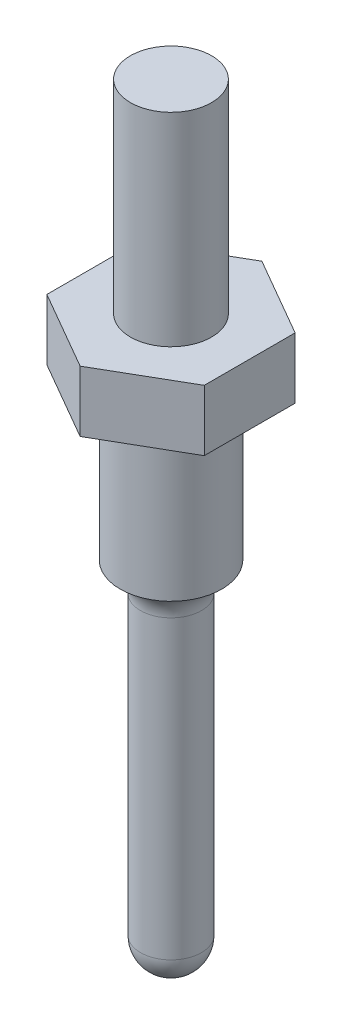
ISO-10303-21;
HEADER;
FILE_DESCRIPTION(('STEP AP214'),'2;1');
FILE_NAME('part.step','',(''),(''),'','','');
FILE_SCHEMA(('AUTOMOTIVE_DESIGN { 1 0 10303 214 1 1 1 1 }'));
ENDSEC;
DATA;
#1=APPLICATION_CONTEXT('core data for automotive mechanical design processes');
#2=APPLICATION_PROTOCOL_DEFINITION('international standard','automotive_design',2000,#1);
#3=PRODUCT_CONTEXT('',#1,'mechanical');
#4=PRODUCT('Part','Part','',(#3));
#5=PRODUCT_RELATED_PRODUCT_CATEGORY('part','',(#4));
#6=PRODUCT_DEFINITION_FORMATION('','',#4);
#7=PRODUCT_DEFINITION_CONTEXT('part definition',#1,'design');
#8=PRODUCT_DEFINITION('design','',#6,#7);
#9=PRODUCT_DEFINITION_SHAPE('','',#8);
#10=(LENGTH_UNIT() NAMED_UNIT(*) SI_UNIT(.MILLI.,.METRE.));
#11=(NAMED_UNIT(*) PLANE_ANGLE_UNIT() SI_UNIT($,.RADIAN.));
#12=(NAMED_UNIT(*) SI_UNIT($,.STERADIAN.) SOLID_ANGLE_UNIT());
#13=UNCERTAINTY_MEASURE_WITH_UNIT(LENGTH_MEASURE(1.E-05),#10,'distance_accuracy_value','');
#14=(GEOMETRIC_REPRESENTATION_CONTEXT(3) GLOBAL_UNCERTAINTY_ASSIGNED_CONTEXT((#13)) GLOBAL_UNIT_ASSIGNED_CONTEXT((#10,
#11,#12)) REPRESENTATION_CONTEXT('',''));
#15=CARTESIAN_POINT('',(0.,0.,0.));
#16=DIRECTION('',(0.,0.,1.));
#17=DIRECTION('',(1.,0.,0.));
#18=AXIS2_PLACEMENT_3D('',#15,#16,#17);
#19=CARTESIAN_POINT('',(0.,56.,0.));
#20=DIRECTION('',(0.,1.,0.));
#21=DIRECTION('',(0.,0.,1.));
#22=AXIS2_PLACEMENT_3D('',#19,#20,#21);
#23=PLANE('',#22);
#24=DIRECTION('',(0.866025403784438,0.,-0.5));
#25=VECTOR('',#24,1.);
#26=CARTESIAN_POINT('',(0.,56.,8.9489291724392));
#27=LINE('',#26,#25);
#28=CARTESIAN_POINT('',(0.,56.,8.9489291724392));
#29=VERTEX_POINT('',#28);
#30=CARTESIAN_POINT('',(7.75,56.,4.47446458621959));
#31=VERTEX_POINT('',#30);
#32=EDGE_CURVE('E129',#29,#31,#27,.T.);
#33=ORIENTED_EDGE('',*,*,#32,.T.);
#34=DIRECTION('',(0.,0.,-1.));
#35=VECTOR('',#34,1.);
#36=CARTESIAN_POINT('',(7.75,56.,4.47446458621959));
#37=LINE('',#36,#35);
#38=CARTESIAN_POINT('',(7.75,56.,-4.4744645862196));
#39=VERTEX_POINT('',#38);
#40=EDGE_CURVE('E87',#31,#39,#37,.T.);
#41=ORIENTED_EDGE('',*,*,#40,.T.);
#42=DIRECTION('',(-0.866025403784439,0.,-0.5));
#43=VECTOR('',#42,1.);
#44=CARTESIAN_POINT('',(7.75,56.,-4.4744645862196));
#45=LINE('',#44,#43);
#46=CARTESIAN_POINT('',(0.,56.,-8.9489291724392));
#47=VERTEX_POINT('',#46);
#48=EDGE_CURVE('E100',#39,#47,#45,.T.);
#49=ORIENTED_EDGE('',*,*,#48,.T.);
#50=DIRECTION('',(-0.866025403784438,0.,0.5));
#51=VECTOR('',#50,1.);
#52=CARTESIAN_POINT('',(0.,56.,-8.9489291724392));
#53=LINE('',#52,#51);
#54=CARTESIAN_POINT('',(-7.75,56.,-4.4744645862196));
#55=VERTEX_POINT('',#54);
#56=EDGE_CURVE('E94',#47,#55,#53,.T.);
#57=ORIENTED_EDGE('',*,*,#56,.T.);
#58=DIRECTION('',(0.,0.,1.));
#59=VECTOR('',#58,1.);
#60=CARTESIAN_POINT('',(-7.75,56.,-4.4744645862196));
#61=LINE('',#60,#59);
#62=CARTESIAN_POINT('',(-7.75,56.,4.4744645862196));
#63=VERTEX_POINT('',#62);
#64=EDGE_CURVE('E98',#55,#63,#61,.T.);
#65=ORIENTED_EDGE('',*,*,#64,.T.);
#66=DIRECTION('',(0.866025403784439,0.,0.5));
#67=VECTOR('',#66,1.);
#68=CARTESIAN_POINT('',(-7.75,56.,4.4744645862196));
#69=LINE('',#68,#67);
#70=EDGE_CURVE('E49',#63,#29,#69,.T.);
#71=ORIENTED_EDGE('',*,*,#70,.T.);
#72=EDGE_LOOP('',(#33,#41,#49,#57,#65,#71));
#73=FACE_BOUND('',#72,.T.);
#74=CARTESIAN_POINT('',(0.,56.,0.));
#75=DIRECTION('',(0.,1.,0.));
#76=DIRECTION('',(0.,0.,1.));
#77=AXIS2_PLACEMENT_3D('',#74,#75,#76);
#78=CIRCLE('',#77,4.);
#79=CARTESIAN_POINT('',(0.,56.,4.));
#80=VERTEX_POINT('',#79);
#81=EDGE_CURVE('E198',#80,#80,#78,.T.);
#82=ORIENTED_EDGE('',*,*,#81,.F.);
#83=EDGE_LOOP('',(#82));
#84=FACE_BOUND('',#83,.T.);
#85=ADVANCED_FACE('F32',(#73,#84),#23,.T.);
#86=CARTESIAN_POINT('',(0.,35.,0.));
#87=DIRECTION('',(0.,-1.,0.));
#88=DIRECTION('',(0.,0.,-1.));
#89=AXIS2_PLACEMENT_3D('',#86,#87,#88);
#90=CYLINDRICAL_SURFACE('',#89,3.);
#91=CARTESIAN_POINT('',(0.,32.1715728752538,0.));
#92=DIRECTION('',(0.,1.,0.));
#93=DIRECTION('',(0.,0.,1.));
#94=AXIS2_PLACEMENT_3D('',#91,#92,#93);
#95=CIRCLE('',#94,3.);
#96=CARTESIAN_POINT('',(0.,32.1715728752538,3.));
#97=VERTEX_POINT('',#96);
#98=EDGE_CURVE('E11',#97,#97,#95,.F.);
#99=ORIENTED_EDGE('',*,*,#98,.T.);
#100=EDGE_LOOP('',(#99));
#101=FACE_BOUND('',#100,.T.);
#102=CARTESIAN_POINT('',(0.,3.,0.));
#103=DIRECTION('',(0.,-1.,0.));
#104=DIRECTION('',(0.,0.,-1.));
#105=AXIS2_PLACEMENT_3D('',#102,#103,#104);
#106=CIRCLE('',#105,3.);
#107=CARTESIAN_POINT('',(0.,3.,-3.));
#108=VERTEX_POINT('',#107);
#109=EDGE_CURVE('E41',#108,#108,#106,.F.);
#110=ORIENTED_EDGE('',*,*,#109,.T.);
#111=EDGE_LOOP('',(#110));
#112=FACE_BOUND('',#111,.T.);
#113=ADVANCED_FACE('F146',(#101,#112),#90,.T.);
#114=CARTESIAN_POINT('',(0.,3.,0.));
#115=DIRECTION('',(0.,0.,1.));
#116=DIRECTION('',(1.,0.,0.));
#117=AXIS2_PLACEMENT_3D('',#114,#115,#116);
#118=SPHERICAL_SURFACE('',#117,3.);
#119=CARTESIAN_POINT('',(0.,3.,0.));
#120=DIRECTION('',(0.,-1.,0.));
#121=DIRECTION('',(0.,0.,-1.));
#122=AXIS2_PLACEMENT_3D('',#119,#120,#121);
#123=SPHERICAL_SURFACE('',#122,3.);
#124=ORIENTED_EDGE('',*,*,#109,.F.);
#125=EDGE_LOOP('',(#124));
#126=FACE_BOUND('',#125,.T.);
#127=ADVANCED_FACE('F148',(#126),#123,.T.);
#128=CARTESIAN_POINT('',(0.,50.,0.));
#129=DIRECTION('',(0.,-1.,0.));
#130=DIRECTION('',(0.,0.,-1.));
#131=AXIS2_PLACEMENT_3D('',#128,#129,#130);
#132=CYLINDRICAL_SURFACE('',#131,5.);
#133=CARTESIAN_POINT('',(0.,50.,0.));
#134=DIRECTION('',(0.,1.,0.));
#135=DIRECTION('',(0.,0.,1.));
#136=AXIS2_PLACEMENT_3D('',#133,#134,#135);
#137=CIRCLE('',#136,5.);
#138=CARTESIAN_POINT('',(0.,50.,5.));
#139=VERTEX_POINT('',#138);
#140=EDGE_CURVE('E139',#139,#139,#137,.T.);
#141=ORIENTED_EDGE('',*,*,#140,.F.);
#142=EDGE_LOOP('',(#141));
#143=FACE_BOUND('',#142,.T.);
#144=CARTESIAN_POINT('',(0.,35.,0.));
#145=DIRECTION('',(0.,1.,0.));
#146=DIRECTION('',(0.,0.,1.));
#147=AXIS2_PLACEMENT_3D('',#144,#145,#146);
#148=CIRCLE('',#147,5.);
#149=CARTESIAN_POINT('',(0.,35.,5.));
#150=VERTEX_POINT('',#149);
#151=EDGE_CURVE('E138',#150,#150,#148,.T.);
#152=ORIENTED_EDGE('',*,*,#151,.T.);
#153=EDGE_LOOP('',(#152));
#154=FACE_BOUND('',#153,.T.);
#155=ADVANCED_FACE('F150',(#143,#154),#132,.T.);
#156=CARTESIAN_POINT('',(0.,50.,0.));
#157=DIRECTION('',(0.,1.,0.));
#158=DIRECTION('',(0.,0.,1.));
#159=AXIS2_PLACEMENT_3D('',#156,#157,#158);
#160=PLANE('',#159);
#161=DIRECTION('',(0.866025403784438,0.,-0.5));
#162=VECTOR('',#161,1.);
#163=CARTESIAN_POINT('',(0.,50.,8.9489291724392));
#164=LINE('',#163,#162);
#165=CARTESIAN_POINT('',(0.,50.,8.9489291724392));
#166=VERTEX_POINT('',#165);
#167=CARTESIAN_POINT('',(7.75,50.,4.47446458621959));
#168=VERTEX_POINT('',#167);
#169=EDGE_CURVE('E118',#166,#168,#164,.T.);
#170=ORIENTED_EDGE('',*,*,#169,.F.);
#171=DIRECTION('',(0.866025403784439,0.,0.5));
#172=VECTOR('',#171,1.);
#173=CARTESIAN_POINT('',(-7.75,50.,4.4744645862196));
#174=LINE('',#173,#172);
#175=CARTESIAN_POINT('',(-7.75,50.,4.4744645862196));
#176=VERTEX_POINT('',#175);
#177=EDGE_CURVE('E78',#176,#166,#174,.T.);
#178=ORIENTED_EDGE('',*,*,#177,.F.);
#179=DIRECTION('',(0.,0.,1.));
#180=VECTOR('',#179,1.);
#181=CARTESIAN_POINT('',(-7.75,50.,-4.4744645862196));
#182=LINE('',#181,#180);
#183=CARTESIAN_POINT('',(-7.75,50.,-4.4744645862196));
#184=VERTEX_POINT('',#183);
#185=EDGE_CURVE('E72',#184,#176,#182,.T.);
#186=ORIENTED_EDGE('',*,*,#185,.F.);
#187=DIRECTION('',(-0.866025403784438,0.,0.5));
#188=VECTOR('',#187,1.);
#189=CARTESIAN_POINT('',(0.,50.,-8.9489291724392));
#190=LINE('',#189,#188);
#191=CARTESIAN_POINT('',(0.,50.,-8.9489291724392));
#192=VERTEX_POINT('',#191);
#193=EDGE_CURVE('E108',#192,#184,#190,.T.);
#194=ORIENTED_EDGE('',*,*,#193,.F.);
#195=DIRECTION('',(-0.866025403784439,0.,-0.5));
#196=VECTOR('',#195,1.);
#197=CARTESIAN_POINT('',(7.75,50.,-4.4744645862196));
#198=LINE('',#197,#196);
#199=CARTESIAN_POINT('',(7.75,50.,-4.4744645862196));
#200=VERTEX_POINT('',#199);
#201=EDGE_CURVE('E124',#200,#192,#198,.T.);
#202=ORIENTED_EDGE('',*,*,#201,.F.);
#203=DIRECTION('',(0.,0.,-1.));
#204=VECTOR('',#203,1.);
#205=CARTESIAN_POINT('',(7.75,50.,4.47446458621959));
#206=LINE('',#205,#204);
#207=EDGE_CURVE('E121',#168,#200,#206,.T.);
#208=ORIENTED_EDGE('',*,*,#207,.F.);
#209=EDGE_LOOP('',(#170,#178,#186,#194,#202,#208));
#210=FACE_BOUND('',#209,.T.);
#211=ORIENTED_EDGE('',*,*,#140,.T.);
#212=EDGE_LOOP('',(#211));
#213=FACE_BOUND('',#212,.T.);
#214=ADVANCED_FACE('F155',(#210,#213),#160,.F.);
#215=CARTESIAN_POINT('',(0.,56.,8.9489291724392));
#216=DIRECTION('',(-0.5,0.,-0.866025403784438));
#217=DIRECTION('',(-0.866025403784438,0.,0.5));
#218=AXIS2_PLACEMENT_3D('',#215,#216,#217);
#219=PLANE('',#218);
#220=ORIENTED_EDGE('',*,*,#169,.T.);
#221=DIRECTION('',(0.,-1.,0.));
#222=VECTOR('',#221,1.);
#223=CARTESIAN_POINT('',(7.75,56.,4.47446458621959));
#224=LINE('',#223,#222);
#225=EDGE_CURVE('E136',#31,#168,#224,.T.);
#226=ORIENTED_EDGE('',*,*,#225,.F.);
#227=ORIENTED_EDGE('',*,*,#32,.F.);
#228=DIRECTION('',(0.,-1.,0.));
#229=VECTOR('',#228,1.);
#230=CARTESIAN_POINT('',(0.,56.,8.9489291724392));
#231=LINE('',#230,#229);
#232=EDGE_CURVE('E114',#29,#166,#231,.T.);
#233=ORIENTED_EDGE('',*,*,#232,.T.);
#234=EDGE_LOOP('',(#220,#226,#227,#233));
#235=FACE_BOUND('',#234,.T.);
#236=ADVANCED_FACE('F170',(#235),#219,.F.);
#237=CARTESIAN_POINT('',(7.75,56.,4.47446458621959));
#238=DIRECTION('',(-1.,0.,0.));
#239=DIRECTION('',(0.,0.,1.));
#240=AXIS2_PLACEMENT_3D('',#237,#238,#239);
#241=PLANE('',#240);
#242=ORIENTED_EDGE('',*,*,#207,.T.);
#243=DIRECTION('',(0.,-1.,0.));
#244=VECTOR('',#243,1.);
#245=CARTESIAN_POINT('',(7.75,56.,-4.4744645862196));
#246=LINE('',#245,#244);
#247=EDGE_CURVE('E133',#39,#200,#246,.T.);
#248=ORIENTED_EDGE('',*,*,#247,.F.);
#249=ORIENTED_EDGE('',*,*,#40,.F.);
#250=ORIENTED_EDGE('',*,*,#225,.T.);
#251=EDGE_LOOP('',(#242,#248,#249,#250));
#252=FACE_BOUND('',#251,.T.);
#253=ADVANCED_FACE('F182',(#252),#241,.F.);
#254=CARTESIAN_POINT('',(7.75,56.,-4.4744645862196));
#255=DIRECTION('',(-0.5,0.,0.866025403784439));
#256=DIRECTION('',(0.866025403784439,0.,0.5));
#257=AXIS2_PLACEMENT_3D('',#254,#255,#256);
#258=PLANE('',#257);
#259=ORIENTED_EDGE('',*,*,#201,.T.);
#260=DIRECTION('',(0.,-1.,0.));
#261=VECTOR('',#260,1.);
#262=CARTESIAN_POINT('',(0.,56.,-8.9489291724392));
#263=LINE('',#262,#261);
#264=EDGE_CURVE('E109',#47,#192,#263,.T.);
#265=ORIENTED_EDGE('',*,*,#264,.F.);
#266=ORIENTED_EDGE('',*,*,#48,.F.);
#267=ORIENTED_EDGE('',*,*,#247,.T.);
#268=EDGE_LOOP('',(#259,#265,#266,#267));
#269=FACE_BOUND('',#268,.T.);
#270=ADVANCED_FACE('F179',(#269),#258,.F.);
#271=CARTESIAN_POINT('',(0.,56.,-8.9489291724392));
#272=DIRECTION('',(0.5,0.,0.866025403784439));
#273=DIRECTION('',(0.866025403784439,0.,-0.5));
#274=AXIS2_PLACEMENT_3D('',#271,#272,#273);
#275=PLANE('',#274);
#276=ORIENTED_EDGE('',*,*,#193,.T.);
#277=DIRECTION('',(0.,-1.,0.));
#278=VECTOR('',#277,1.);
#279=CARTESIAN_POINT('',(-7.75,56.,-4.4744645862196));
#280=LINE('',#279,#278);
#281=EDGE_CURVE('E105',#55,#184,#280,.T.);
#282=ORIENTED_EDGE('',*,*,#281,.F.);
#283=ORIENTED_EDGE('',*,*,#56,.F.);
#284=ORIENTED_EDGE('',*,*,#264,.T.);
#285=EDGE_LOOP('',(#276,#282,#283,#284));
#286=FACE_BOUND('',#285,.T.);
#287=ADVANCED_FACE('F106',(#286),#275,.F.);
#288=CARTESIAN_POINT('',(-7.75,56.,-4.4744645862196));
#289=DIRECTION('',(1.,0.,0.));
#290=DIRECTION('',(0.,0.,-1.));
#291=AXIS2_PLACEMENT_3D('',#288,#289,#290);
#292=PLANE('',#291);
#293=ORIENTED_EDGE('',*,*,#185,.T.);
#294=DIRECTION('',(0.,-1.,0.));
#295=VECTOR('',#294,1.);
#296=CARTESIAN_POINT('',(-7.75,56.,4.4744645862196));
#297=LINE('',#296,#295);
#298=EDGE_CURVE('E110',#63,#176,#297,.T.);
#299=ORIENTED_EDGE('',*,*,#298,.F.);
#300=ORIENTED_EDGE('',*,*,#64,.F.);
#301=ORIENTED_EDGE('',*,*,#281,.T.);
#302=EDGE_LOOP('',(#293,#299,#300,#301));
#303=FACE_BOUND('',#302,.T.);
#304=ADVANCED_FACE('F112',(#303),#292,.F.);
#305=CARTESIAN_POINT('',(-7.75,56.,4.4744645862196));
#306=DIRECTION('',(0.5,0.,-0.866025403784439));
#307=DIRECTION('',(-0.866025403784439,0.,-0.5));
#308=AXIS2_PLACEMENT_3D('',#305,#306,#307);
#309=PLANE('',#308);
#310=ORIENTED_EDGE('',*,*,#177,.T.);
#311=ORIENTED_EDGE('',*,*,#232,.F.);
#312=ORIENTED_EDGE('',*,*,#70,.F.);
#313=ORIENTED_EDGE('',*,*,#298,.T.);
#314=EDGE_LOOP('',(#310,#311,#312,#313));
#315=FACE_BOUND('',#314,.T.);
#316=ADVANCED_FACE('F172',(#315),#309,.F.);
#317=CARTESIAN_POINT('',(0.,76.,0.));
#318=DIRECTION('',(0.,-1.,0.));
#319=DIRECTION('',(0.,0.,-1.));
#320=AXIS2_PLACEMENT_3D('',#317,#318,#319);
#321=CYLINDRICAL_SURFACE('',#320,4.);
#322=CARTESIAN_POINT('',(0.,76.,0.));
#323=DIRECTION('',(0.,1.,0.));
#324=DIRECTION('',(0.,0.,1.));
#325=AXIS2_PLACEMENT_3D('',#322,#323,#324);
#326=CIRCLE('',#325,4.);
#327=CARTESIAN_POINT('',(0.,76.,4.));
#328=VERTEX_POINT('',#327);
#329=EDGE_CURVE('E122',#328,#328,#326,.T.);
#330=ORIENTED_EDGE('',*,*,#329,.F.);
#331=EDGE_LOOP('',(#330));
#332=FACE_BOUND('',#331,.T.);
#333=ORIENTED_EDGE('',*,*,#81,.T.);
#334=EDGE_LOOP('',(#333));
#335=FACE_BOUND('',#334,.T.);
#336=ADVANCED_FACE('F166',(#332,#335),#321,.T.);
#337=CARTESIAN_POINT('',(0.,76.,0.));
#338=DIRECTION('',(0.,1.,0.));
#339=DIRECTION('',(0.,0.,1.));
#340=AXIS2_PLACEMENT_3D('',#337,#338,#339);
#341=PLANE('',#340);
#342=ORIENTED_EDGE('',*,*,#329,.T.);
#343=EDGE_LOOP('',(#342));
#344=FACE_BOUND('',#343,.T.);
#345=ADVANCED_FACE('F204',(#344),#341,.T.);
#346=CARTESIAN_POINT('',(0.,32.1715728752538,0.));
#347=DIRECTION('',(0.,1.,0.));
#348=DIRECTION('',(0.,0.,1.));
#349=AXIS2_PLACEMENT_3D('',#346,#347,#348);
#350=TOROIDAL_SURFACE('',#349,6.,3.);
#351=ORIENTED_EDGE('',*,*,#98,.F.);
#352=EDGE_LOOP('',(#351));
#353=FACE_BOUND('',#352,.T.);
#354=ORIENTED_EDGE('',*,*,#151,.F.);
#355=EDGE_LOOP('',(#354));
#356=FACE_BOUND('',#355,.T.);
#357=ADVANCED_FACE('F34',(#353,#356),#350,.F.);
#358=CLOSED_SHELL('',(#85,#113,#127,#155,#214,#236,#253,#270,#287,#304,#316,#336,#345,#357));
#359=MANIFOLD_SOLID_BREP('B2',#358);
#360=ADVANCED_BREP_SHAPE_REPRESENTATION('',(#18,#359),#14);
#361=SHAPE_DEFINITION_REPRESENTATION(#9,#360);
ENDSEC;
END-ISO-10303-21;
